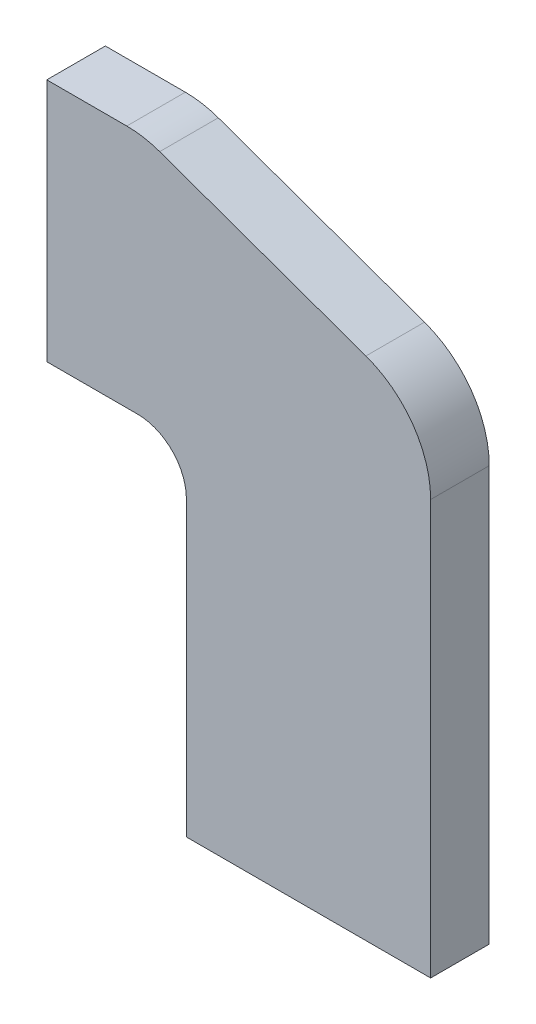
ISO-10303-21;
HEADER;
FILE_DESCRIPTION(('STEP AP214'),'2;1');
FILE_NAME('part.step','',(''),(''),'','','');
FILE_SCHEMA(('AUTOMOTIVE_DESIGN { 1 0 10303 214 1 1 1 1 }'));
ENDSEC;
DATA;
#1=APPLICATION_CONTEXT('core data for automotive mechanical design processes');
#2=APPLICATION_PROTOCOL_DEFINITION('international standard','automotive_design',2000,#1);
#3=PRODUCT_CONTEXT('',#1,'mechanical');
#4=PRODUCT('Part','Part','',(#3));
#5=PRODUCT_RELATED_PRODUCT_CATEGORY('part','',(#4));
#6=PRODUCT_DEFINITION_FORMATION('','',#4);
#7=PRODUCT_DEFINITION_CONTEXT('part definition',#1,'design');
#8=PRODUCT_DEFINITION('design','',#6,#7);
#9=PRODUCT_DEFINITION_SHAPE('','',#8);
#10=(LENGTH_UNIT() NAMED_UNIT(*) SI_UNIT(.MILLI.,.METRE.));
#11=(NAMED_UNIT(*) PLANE_ANGLE_UNIT() SI_UNIT($,.RADIAN.));
#12=(NAMED_UNIT(*) SI_UNIT($,.STERADIAN.) SOLID_ANGLE_UNIT());
#13=UNCERTAINTY_MEASURE_WITH_UNIT(LENGTH_MEASURE(1.E-05),#10,'distance_accuracy_value','');
#14=(GEOMETRIC_REPRESENTATION_CONTEXT(3) GLOBAL_UNCERTAINTY_ASSIGNED_CONTEXT((#13)) GLOBAL_UNIT_ASSIGNED_CONTEXT((#10,
#11,#12)) REPRESENTATION_CONTEXT('',''));
#15=CARTESIAN_POINT('',(0.,0.,0.));
#16=DIRECTION('',(0.,0.,1.));
#17=DIRECTION('',(1.,0.,0.));
#18=AXIS2_PLACEMENT_3D('',#15,#16,#17);
#19=CARTESIAN_POINT('',(0.,0.,12.));
#20=DIRECTION('',(1.,0.,0.));
#21=DIRECTION('',(0.,1.,0.));
#22=AXIS2_PLACEMENT_3D('',#19,#20,#21);
#23=PLANE('',#22);
#24=CARTESIAN_POINT('',(0.,7.,6.));
#25=DIRECTION('',(-1.,0.,0.));
#26=DIRECTION('',(0.,-1.,0.));
#27=AXIS2_PLACEMENT_3D('',#24,#25,#26);
#28=CIRCLE('',#27,2.5);
#29=CARTESIAN_POINT('',(0.,4.5,6.));
#30=VERTEX_POINT('',#29);
#31=EDGE_CURVE('E149',#30,#30,#28,.T.);
#32=ORIENTED_EDGE('',*,*,#31,.F.);
#33=EDGE_LOOP('',(#32));
#34=FACE_BOUND('',#33,.T.);
#35=CARTESIAN_POINT('',(0.,41.,6.));
#36=DIRECTION('',(-1.,0.,0.));
#37=DIRECTION('',(0.,-1.,0.));
#38=AXIS2_PLACEMENT_3D('',#35,#36,#37);
#39=CIRCLE('',#38,2.5);
#40=CARTESIAN_POINT('',(0.,38.5,6.));
#41=VERTEX_POINT('',#40);
#42=EDGE_CURVE('E144',#41,#41,#39,.T.);
#43=ORIENTED_EDGE('',*,*,#42,.F.);
#44=EDGE_LOOP('',(#43));
#45=FACE_BOUND('',#44,.T.);
#46=DIRECTION('',(0.,-1.,0.));
#47=VECTOR('',#46,1.);
#48=CARTESIAN_POINT('',(0.,0.,0.));
#49=LINE('',#48,#47);
#50=CARTESIAN_POINT('',(0.,50.,0.));
#51=VERTEX_POINT('',#50);
#52=CARTESIAN_POINT('',(0.,0.,0.));
#53=VERTEX_POINT('',#52);
#54=EDGE_CURVE('E159',#51,#53,#49,.T.);
#55=ORIENTED_EDGE('',*,*,#54,.T.);
#56=DIRECTION('',(0.,0.,-1.));
#57=VECTOR('',#56,1.);
#58=CARTESIAN_POINT('',(0.,0.,12.));
#59=LINE('',#58,#57);
#60=CARTESIAN_POINT('',(0.,0.,12.));
#61=VERTEX_POINT('',#60);
#62=EDGE_CURVE('E177',#61,#53,#59,.T.);
#63=ORIENTED_EDGE('',*,*,#62,.F.);
#64=DIRECTION('',(0.,-1.,0.));
#65=VECTOR('',#64,1.);
#66=CARTESIAN_POINT('',(0.,0.,12.));
#67=LINE('',#66,#65);
#68=CARTESIAN_POINT('',(0.,50.,12.));
#69=VERTEX_POINT('',#68);
#70=EDGE_CURVE('E161',#69,#61,#67,.T.);
#71=ORIENTED_EDGE('',*,*,#70,.F.);
#72=DIRECTION('',(0.,0.,-1.));
#73=VECTOR('',#72,1.);
#74=CARTESIAN_POINT('',(0.,50.,12.));
#75=LINE('',#74,#73);
#76=EDGE_CURVE('E169',#69,#51,#75,.T.);
#77=ORIENTED_EDGE('',*,*,#76,.T.);
#78=EDGE_LOOP('',(#55,#63,#71,#77));
#79=FACE_BOUND('',#78,.T.);
#80=ADVANCED_FACE('F34',(#34,#45,#79),#23,.F.);
#81=CARTESIAN_POINT('',(0.,0.,12.));
#82=DIRECTION('',(0.,1.,0.));
#83=DIRECTION('',(0.,0.,1.));
#84=AXIS2_PLACEMENT_3D('',#81,#82,#83);
#85=PLANE('',#84);
#86=DIRECTION('',(1.,0.,0.));
#87=VECTOR('',#86,1.);
#88=CARTESIAN_POINT('',(0.,0.,0.));
#89=LINE('',#88,#87);
#90=CARTESIAN_POINT('',(18.59583866,0.,0.));
#91=VERTEX_POINT('',#90);
#92=EDGE_CURVE('E121',#53,#91,#89,.T.);
#93=ORIENTED_EDGE('',*,*,#92,.T.);
#94=DIRECTION('',(0.,0.,1.));
#95=VECTOR('',#94,1.);
#96=CARTESIAN_POINT('',(18.59583866,0.,12.));
#97=LINE('',#96,#95);
#98=CARTESIAN_POINT('',(18.59583866,0.,12.));
#99=VERTEX_POINT('',#98);
#100=EDGE_CURVE('E198',#91,#99,#97,.T.);
#101=ORIENTED_EDGE('',*,*,#100,.T.);
#102=DIRECTION('',(1.,0.,0.));
#103=VECTOR('',#102,1.);
#104=CARTESIAN_POINT('',(0.,0.,12.));
#105=LINE('',#104,#103);
#106=EDGE_CURVE('E164',#61,#99,#105,.T.);
#107=ORIENTED_EDGE('',*,*,#106,.F.);
#108=ORIENTED_EDGE('',*,*,#62,.T.);
#109=EDGE_LOOP('',(#93,#101,#107,#108));
#110=FACE_BOUND('',#109,.T.);
#111=ADVANCED_FACE('F203',(#110),#85,.F.);
#112=CARTESIAN_POINT('',(78.62,0.,12.));
#113=DIRECTION('',(-1.,0.,0.));
#114=DIRECTION('',(0.,-1.,0.));
#115=AXIS2_PLACEMENT_3D('',#112,#113,#114);
#116=PLANE('',#115);
#117=DIRECTION('',(0.,1.,0.));
#118=VECTOR('',#117,1.);
#119=CARTESIAN_POINT('',(78.62,0.,0.));
#120=LINE('',#119,#118);
#121=CARTESIAN_POINT('',(78.62,-70.,0.));
#122=VERTEX_POINT('',#121);
#123=CARTESIAN_POINT('',(78.62,14.8716390702295,0.));
#124=VERTEX_POINT('',#123);
#125=EDGE_CURVE('E109',#122,#124,#120,.T.);
#126=ORIENTED_EDGE('',*,*,#125,.T.);
#127=DIRECTION('',(0.,0.,1.));
#128=VECTOR('',#127,1.);
#129=CARTESIAN_POINT('',(78.62,14.8716390702295,12.));
#130=LINE('',#129,#128);
#131=CARTESIAN_POINT('',(78.62,14.8716390702295,12.));
#132=VERTEX_POINT('',#131);
#133=EDGE_CURVE('E180',#124,#132,#130,.T.);
#134=ORIENTED_EDGE('',*,*,#133,.T.);
#135=DIRECTION('',(0.,1.,0.));
#136=VECTOR('',#135,1.);
#137=CARTESIAN_POINT('',(78.62,0.,12.));
#138=LINE('',#137,#136);
#139=CARTESIAN_POINT('',(78.62,-70.,12.));
#140=VERTEX_POINT('',#139);
#141=EDGE_CURVE('E127',#140,#132,#138,.T.);
#142=ORIENTED_EDGE('',*,*,#141,.F.);
#143=DIRECTION('',(0.,0.,1.));
#144=VECTOR('',#143,1.);
#145=CARTESIAN_POINT('',(78.62,-70.,-94.3526190297352));
#146=LINE('',#145,#144);
#147=EDGE_CURVE('E124',#122,#140,#146,.T.);
#148=ORIENTED_EDGE('',*,*,#147,.F.);
#149=EDGE_LOOP('',(#126,#134,#142,#148));
#150=FACE_BOUND('',#149,.T.);
#151=ADVANCED_FACE('F125',(#150),#116,.F.);
#152=CARTESIAN_POINT('',(0.,50.,12.));
#153=DIRECTION('',(0.,-1.,0.));
#154=DIRECTION('',(0.,0.,-1.));
#155=AXIS2_PLACEMENT_3D('',#152,#153,#154);
#156=PLANE('',#155);
#157=DIRECTION('',(-1.,0.,0.));
#158=VECTOR('',#157,1.);
#159=CARTESIAN_POINT('',(0.,50.,12.));
#160=LINE('',#159,#158);
#161=CARTESIAN_POINT('',(16.3850409596238,50.,12.));
#162=VERTEX_POINT('',#161);
#163=EDGE_CURVE('E167',#162,#69,#160,.T.);
#164=ORIENTED_EDGE('',*,*,#163,.F.);
#165=DIRECTION('',(0.,0.,1.));
#166=VECTOR('',#165,1.);
#167=CARTESIAN_POINT('',(16.3850409596238,50.,12.));
#168=LINE('',#167,#166);
#169=CARTESIAN_POINT('',(16.3850409596238,50.,0.));
#170=VERTEX_POINT('',#169);
#171=EDGE_CURVE('E194',#162,#170,#168,.F.);
#172=ORIENTED_EDGE('',*,*,#171,.T.);
#173=DIRECTION('',(-1.,0.,0.));
#174=VECTOR('',#173,1.);
#175=CARTESIAN_POINT('',(0.,50.,0.));
#176=LINE('',#175,#174);
#177=EDGE_CURVE('E120',#170,#51,#176,.T.);
#178=ORIENTED_EDGE('',*,*,#177,.T.);
#179=ORIENTED_EDGE('',*,*,#76,.F.);
#180=EDGE_LOOP('',(#164,#172,#178,#179));
#181=FACE_BOUND('',#180,.T.);
#182=ADVANCED_FACE('F280',(#181),#156,.F.);
#183=CARTESIAN_POINT('',(0.,0.,12.));
#184=DIRECTION('',(0.,0.,-1.));
#185=DIRECTION('',(-1.,0.,0.));
#186=AXIS2_PLACEMENT_3D('',#183,#184,#185);
#187=PLANE('',#186);
#188=ORIENTED_EDGE('',*,*,#106,.T.);
#189=CARTESIAN_POINT('',(18.59583866,-10.,12.));
#190=DIRECTION('',(0.,0.,-1.));
#191=DIRECTION('',(-1.,0.,0.));
#192=AXIS2_PLACEMENT_3D('',#189,#190,#191);
#193=CIRCLE('',#192,10.);
#194=CARTESIAN_POINT('',(28.59583866,-10.,12.));
#195=VERTEX_POINT('',#194);
#196=EDGE_CURVE('E42',#99,#195,#193,.T.);
#197=ORIENTED_EDGE('',*,*,#196,.T.);
#198=DIRECTION('',(0.,-1.,0.));
#199=VECTOR('',#198,1.);
#200=CARTESIAN_POINT('',(28.59583866,9.99999999999999,12.));
#201=LINE('',#200,#199);
#202=CARTESIAN_POINT('',(28.59583866,-70.,12.));
#203=VERTEX_POINT('',#202);
#204=EDGE_CURVE('E138',#195,#203,#201,.T.);
#205=ORIENTED_EDGE('',*,*,#204,.T.);
#206=DIRECTION('',(1.,0.,0.));
#207=VECTOR('',#206,1.);
#208=CARTESIAN_POINT('',(28.59583866,-70.,12.));
#209=LINE('',#208,#207);
#210=EDGE_CURVE('E136',#203,#140,#209,.T.);
#211=ORIENTED_EDGE('',*,*,#210,.T.);
#212=ORIENTED_EDGE('',*,*,#141,.T.);
#213=CARTESIAN_POINT('',(58.62,14.8716390702295,12.));
#214=DIRECTION('',(0.,0.,-1.));
#215=DIRECTION('',(-1.,0.,0.));
#216=AXIS2_PLACEMENT_3D('',#213,#214,#215);
#217=CIRCLE('',#216,20.);
#218=CARTESIAN_POINT('',(65.3642982184908,33.7001929589397,12.));
#219=VERTEX_POINT('',#218);
#220=EDGE_CURVE('E182',#132,#219,#217,.F.);
#221=ORIENTED_EDGE('',*,*,#220,.T.);
#222=DIRECTION('',(0.941427694435507,-0.337214910924539,0.));
#223=VECTOR('',#222,1.);
#224=CARTESIAN_POINT('',(19.8589268209521,50.,12.));
#225=LINE('',#224,#223);
#226=CARTESIAN_POINT('',(23.1293391781145,48.8285538887102,12.));
#227=VERTEX_POINT('',#226);
#228=EDGE_CURVE('E148',#227,#219,#225,.T.);
#229=ORIENTED_EDGE('',*,*,#228,.F.);
#230=CARTESIAN_POINT('',(16.3850409596238,30.,12.));
#231=DIRECTION('',(0.,0.,-1.));
#232=DIRECTION('',(-1.,0.,0.));
#233=AXIS2_PLACEMENT_3D('',#230,#231,#232);
#234=CIRCLE('',#233,20.);
#235=EDGE_CURVE('E192',#227,#162,#234,.F.);
#236=ORIENTED_EDGE('',*,*,#235,.T.);
#237=ORIENTED_EDGE('',*,*,#163,.T.);
#238=ORIENTED_EDGE('',*,*,#70,.T.);
#239=EDGE_LOOP('',(#188,#197,#205,#211,#212,#221,#229,#236,#237,#238));
#240=FACE_BOUND('',#239,.T.);
#241=ADVANCED_FACE('F206',(#240),#187,.F.);
#242=CARTESIAN_POINT('',(0.,0.,0.));
#243=DIRECTION('',(0.,0.,-1.));
#244=DIRECTION('',(-1.,0.,0.));
#245=AXIS2_PLACEMENT_3D('',#242,#243,#244);
#246=PLANE('',#245);
#247=DIRECTION('',(0.,-1.,0.));
#248=VECTOR('',#247,1.);
#249=CARTESIAN_POINT('',(28.59583866,9.99999999999999,0.));
#250=LINE('',#249,#248);
#251=CARTESIAN_POINT('',(28.59583866,-10.,0.));
#252=VERTEX_POINT('',#251);
#253=CARTESIAN_POINT('',(28.59583866,-70.,0.));
#254=VERTEX_POINT('',#253);
#255=EDGE_CURVE('E131',#252,#254,#250,.T.);
#256=ORIENTED_EDGE('',*,*,#255,.F.);
#257=CARTESIAN_POINT('',(18.59583866,-10.,0.));
#258=DIRECTION('',(0.,0.,-1.));
#259=DIRECTION('',(-1.,0.,0.));
#260=AXIS2_PLACEMENT_3D('',#257,#258,#259);
#261=CIRCLE('',#260,10.);
#262=EDGE_CURVE('E11',#252,#91,#261,.F.);
#263=ORIENTED_EDGE('',*,*,#262,.T.);
#264=ORIENTED_EDGE('',*,*,#92,.F.);
#265=ORIENTED_EDGE('',*,*,#54,.F.);
#266=ORIENTED_EDGE('',*,*,#177,.F.);
#267=CARTESIAN_POINT('',(16.3850409596238,30.,0.));
#268=DIRECTION('',(0.,0.,-1.));
#269=DIRECTION('',(-1.,0.,0.));
#270=AXIS2_PLACEMENT_3D('',#267,#268,#269);
#271=CIRCLE('',#270,20.);
#272=CARTESIAN_POINT('',(23.1293391781145,48.8285538887102,0.));
#273=VERTEX_POINT('',#272);
#274=EDGE_CURVE('E196',#170,#273,#271,.T.);
#275=ORIENTED_EDGE('',*,*,#274,.T.);
#276=DIRECTION('',(0.941427694435507,-0.337214910924539,0.));
#277=VECTOR('',#276,1.);
#278=CARTESIAN_POINT('',(19.8589268209521,50.,0.));
#279=LINE('',#278,#277);
#280=CARTESIAN_POINT('',(65.3642982184908,33.7001929589397,0.));
#281=VERTEX_POINT('',#280);
#282=EDGE_CURVE('E157',#273,#281,#279,.T.);
#283=ORIENTED_EDGE('',*,*,#282,.T.);
#284=CARTESIAN_POINT('',(58.62,14.8716390702295,0.));
#285=DIRECTION('',(0.,0.,-1.));
#286=DIRECTION('',(-1.,0.,0.));
#287=AXIS2_PLACEMENT_3D('',#284,#285,#286);
#288=CIRCLE('',#287,20.);
#289=EDGE_CURVE('E116',#281,#124,#288,.T.);
#290=ORIENTED_EDGE('',*,*,#289,.T.);
#291=ORIENTED_EDGE('',*,*,#125,.F.);
#292=DIRECTION('',(1.,0.,0.));
#293=VECTOR('',#292,1.);
#294=CARTESIAN_POINT('',(28.59583866,-70.,0.));
#295=LINE('',#294,#293);
#296=EDGE_CURVE('E113',#254,#122,#295,.T.);
#297=ORIENTED_EDGE('',*,*,#296,.F.);
#298=EDGE_LOOP('',(#256,#263,#264,#265,#266,#275,#283,#290,#291,#297));
#299=FACE_BOUND('',#298,.T.);
#300=ADVANCED_FACE('F111',(#299),#246,.T.);
#301=CARTESIAN_POINT('',(19.8589268209521,50.,0.));
#302=DIRECTION('',(-0.337214910924539,-0.941427694435508,0.));
#303=DIRECTION('',(0.941427694435508,-0.337214910924539,0.));
#304=AXIS2_PLACEMENT_3D('',#301,#302,#303);
#305=PLANE('',#304);
#306=ORIENTED_EDGE('',*,*,#282,.F.);
#307=DIRECTION('',(0.,0.,1.));
#308=VECTOR('',#307,1.);
#309=CARTESIAN_POINT('',(23.1293391781145,48.8285538887102,0.));
#310=LINE('',#309,#308);
#311=EDGE_CURVE('E189',#273,#227,#310,.T.);
#312=ORIENTED_EDGE('',*,*,#311,.T.);
#313=ORIENTED_EDGE('',*,*,#228,.T.);
#314=DIRECTION('',(0.,0.,1.));
#315=VECTOR('',#314,1.);
#316=CARTESIAN_POINT('',(65.3642982184908,33.7001929589397,0.));
#317=LINE('',#316,#315);
#318=EDGE_CURVE('E185',#219,#281,#317,.F.);
#319=ORIENTED_EDGE('',*,*,#318,.T.);
#320=EDGE_LOOP('',(#306,#312,#313,#319));
#321=FACE_BOUND('',#320,.T.);
#322=ADVANCED_FACE('F241',(#321),#305,.F.);
#323=CARTESIAN_POINT('',(58.62,14.8716390702295,12.));
#324=DIRECTION('',(0.,0.,1.));
#325=DIRECTION('',(1.,0.,0.));
#326=AXIS2_PLACEMENT_3D('',#323,#324,#325);
#327=CYLINDRICAL_SURFACE('',#326,20.);
#328=ORIENTED_EDGE('',*,*,#289,.F.);
#329=ORIENTED_EDGE('',*,*,#318,.F.);
#330=ORIENTED_EDGE('',*,*,#220,.F.);
#331=ORIENTED_EDGE('',*,*,#133,.F.);
#332=EDGE_LOOP('',(#328,#329,#330,#331));
#333=FACE_BOUND('',#332,.T.);
#334=ADVANCED_FACE('F238',(#333),#327,.T.);
#335=CARTESIAN_POINT('',(16.3850409596238,30.,0.));
#336=DIRECTION('',(0.,0.,1.));
#337=DIRECTION('',(1.,0.,0.));
#338=AXIS2_PLACEMENT_3D('',#335,#336,#337);
#339=CYLINDRICAL_SURFACE('',#338,20.);
#340=ORIENTED_EDGE('',*,*,#274,.F.);
#341=ORIENTED_EDGE('',*,*,#171,.F.);
#342=ORIENTED_EDGE('',*,*,#235,.F.);
#343=ORIENTED_EDGE('',*,*,#311,.F.);
#344=EDGE_LOOP('',(#340,#341,#342,#343));
#345=FACE_BOUND('',#344,.T.);
#346=ADVANCED_FACE('F240',(#345),#339,.T.);
#347=CARTESIAN_POINT('',(20.,41.,6.));
#348=DIRECTION('',(-1.,0.,0.));
#349=DIRECTION('',(0.,-1.,0.));
#350=AXIS2_PLACEMENT_3D('',#347,#348,#349);
#351=CYLINDRICAL_SURFACE('',#350,2.5);
#352=CARTESIAN_POINT('',(20.,41.,6.));
#353=DIRECTION('',(-1.,0.,0.));
#354=DIRECTION('',(0.,-1.,0.));
#355=AXIS2_PLACEMENT_3D('',#352,#353,#354);
#356=CIRCLE('',#355,2.5);
#357=CARTESIAN_POINT('',(20.,38.5,6.));
#358=VERTEX_POINT('',#357);
#359=EDGE_CURVE('E152',#358,#358,#356,.T.);
#360=ORIENTED_EDGE('',*,*,#359,.F.);
#361=EDGE_LOOP('',(#360));
#362=FACE_BOUND('',#361,.T.);
#363=ORIENTED_EDGE('',*,*,#42,.T.);
#364=EDGE_LOOP('',(#363));
#365=FACE_BOUND('',#364,.T.);
#366=ADVANCED_FACE('F244',(#362,#365),#351,.F.);
#367=CARTESIAN_POINT('',(20.,41.,6.));
#368=DIRECTION('',(-1.,0.,0.));
#369=DIRECTION('',(0.,-1.,0.));
#370=AXIS2_PLACEMENT_3D('',#367,#368,#369);
#371=PLANE('',#370);
#372=ORIENTED_EDGE('',*,*,#359,.T.);
#373=EDGE_LOOP('',(#372));
#374=FACE_BOUND('',#373,.T.);
#375=ADVANCED_FACE('F249',(#374),#371,.T.);
#376=CARTESIAN_POINT('',(20.,7.00000000000001,6.));
#377=DIRECTION('',(-1.,0.,0.));
#378=DIRECTION('',(0.,-1.,0.));
#379=AXIS2_PLACEMENT_3D('',#376,#377,#378);
#380=CYLINDRICAL_SURFACE('',#379,2.5);
#381=CARTESIAN_POINT('',(20.,7.00000000000001,6.));
#382=DIRECTION('',(-1.,0.,0.));
#383=DIRECTION('',(0.,-1.,0.));
#384=AXIS2_PLACEMENT_3D('',#381,#382,#383);
#385=CIRCLE('',#384,2.5);
#386=CARTESIAN_POINT('',(20.,4.50000000000001,6.));
#387=VERTEX_POINT('',#386);
#388=EDGE_CURVE('E145',#387,#387,#385,.T.);
#389=ORIENTED_EDGE('',*,*,#388,.F.);
#390=EDGE_LOOP('',(#389));
#391=FACE_BOUND('',#390,.T.);
#392=ORIENTED_EDGE('',*,*,#31,.T.);
#393=EDGE_LOOP('',(#392));
#394=FACE_BOUND('',#393,.T.);
#395=ADVANCED_FACE('F265',(#391,#394),#380,.F.);
#396=CARTESIAN_POINT('',(20.,7.00000000000001,6.));
#397=DIRECTION('',(-1.,0.,0.));
#398=DIRECTION('',(0.,-1.,0.));
#399=AXIS2_PLACEMENT_3D('',#396,#397,#398);
#400=PLANE('',#399);
#401=ORIENTED_EDGE('',*,*,#388,.T.);
#402=EDGE_LOOP('',(#401));
#403=FACE_BOUND('',#402,.T.);
#404=ADVANCED_FACE('F260',(#403),#400,.T.);
#405=CARTESIAN_POINT('',(28.59583866,9.99999999999999,-94.3526190297352));
#406=DIRECTION('',(-1.,0.,0.));
#407=DIRECTION('',(0.,-1.,0.));
#408=AXIS2_PLACEMENT_3D('',#405,#406,#407);
#409=PLANE('',#408);
#410=ORIENTED_EDGE('',*,*,#204,.F.);
#411=DIRECTION('',(0.,0.,1.));
#412=VECTOR('',#411,1.);
#413=CARTESIAN_POINT('',(28.59583866,-10.,-94.3526190297352));
#414=LINE('',#413,#412);
#415=EDGE_CURVE('E55',#195,#252,#414,.F.);
#416=ORIENTED_EDGE('',*,*,#415,.T.);
#417=ORIENTED_EDGE('',*,*,#255,.T.);
#418=DIRECTION('',(0.,0.,1.));
#419=VECTOR('',#418,1.);
#420=CARTESIAN_POINT('',(28.59583866,-70.,-94.3526190297352));
#421=LINE('',#420,#419);
#422=EDGE_CURVE('E135',#254,#203,#421,.T.);
#423=ORIENTED_EDGE('',*,*,#422,.T.);
#424=EDGE_LOOP('',(#410,#416,#417,#423));
#425=FACE_BOUND('',#424,.T.);
#426=ADVANCED_FACE('F224',(#425),#409,.T.);
#427=CARTESIAN_POINT('',(28.59583866,-70.,-94.3526190297352));
#428=DIRECTION('',(0.,-1.,0.));
#429=DIRECTION('',(0.,0.,-1.));
#430=AXIS2_PLACEMENT_3D('',#427,#428,#429);
#431=PLANE('',#430);
#432=CARTESIAN_POINT('',(38.59583866,-70.,6.));
#433=DIRECTION('',(0.,-1.,0.));
#434=DIRECTION('',(0.,0.,-1.));
#435=AXIS2_PLACEMENT_3D('',#432,#433,#434);
#436=CIRCLE('',#435,2.5);
#437=CARTESIAN_POINT('',(38.59583866,-70.,3.5));
#438=VERTEX_POINT('',#437);
#439=EDGE_CURVE('E405',#438,#438,#436,.T.);
#440=ORIENTED_EDGE('',*,*,#439,.F.);
#441=EDGE_LOOP('',(#440));
#442=FACE_BOUND('',#441,.T.);
#443=CARTESIAN_POINT('',(68.59583866,-70.,6.));
#444=DIRECTION('',(0.,-1.,0.));
#445=DIRECTION('',(0.,0.,-1.));
#446=AXIS2_PLACEMENT_3D('',#443,#444,#445);
#447=CIRCLE('',#446,2.50000000000001);
#448=CARTESIAN_POINT('',(68.59583866,-70.,3.49999999999999));
#449=VERTEX_POINT('',#448);
#450=EDGE_CURVE('E413',#449,#449,#447,.T.);
#451=ORIENTED_EDGE('',*,*,#450,.F.);
#452=EDGE_LOOP('',(#451));
#453=FACE_BOUND('',#452,.T.);
#454=ORIENTED_EDGE('',*,*,#422,.F.);
#455=ORIENTED_EDGE('',*,*,#296,.T.);
#456=ORIENTED_EDGE('',*,*,#147,.T.);
#457=ORIENTED_EDGE('',*,*,#210,.F.);
#458=EDGE_LOOP('',(#454,#455,#456,#457));
#459=FACE_BOUND('',#458,.T.);
#460=ADVANCED_FACE('F133',(#442,#453,#459),#431,.T.);
#461=CARTESIAN_POINT('',(18.59583866,-10.,12.));
#462=DIRECTION('',(0.,0.,1.));
#463=DIRECTION('',(1.,0.,0.));
#464=AXIS2_PLACEMENT_3D('',#461,#462,#463);
#465=CYLINDRICAL_SURFACE('',#464,10.);
#466=ORIENTED_EDGE('',*,*,#262,.F.);
#467=ORIENTED_EDGE('',*,*,#415,.F.);
#468=ORIENTED_EDGE('',*,*,#196,.F.);
#469=ORIENTED_EDGE('',*,*,#100,.F.);
#470=EDGE_LOOP('',(#466,#467,#468,#469));
#471=FACE_BOUND('',#470,.T.);
#472=ADVANCED_FACE('F36',(#471),#465,.F.);
#473=CARTESIAN_POINT('',(68.59583866,-40.,6.));
#474=DIRECTION('',(0.,-1.,0.));
#475=DIRECTION('',(0.,0.,-1.));
#476=AXIS2_PLACEMENT_3D('',#473,#474,#475);
#477=CYLINDRICAL_SURFACE('',#476,2.50000000000001);
#478=CARTESIAN_POINT('',(68.59583866,-40.,6.));
#479=DIRECTION('',(0.,-1.,0.));
#480=DIRECTION('',(0.,0.,-1.));
#481=AXIS2_PLACEMENT_3D('',#478,#479,#480);
#482=CIRCLE('',#481,2.50000000000001);
#483=CARTESIAN_POINT('',(68.59583866,-40.,3.49999999999999));
#484=VERTEX_POINT('',#483);
#485=EDGE_CURVE('E408',#484,#484,#482,.T.);
#486=ORIENTED_EDGE('',*,*,#485,.F.);
#487=EDGE_LOOP('',(#486));
#488=FACE_BOUND('',#487,.T.);
#489=ORIENTED_EDGE('',*,*,#450,.T.);
#490=EDGE_LOOP('',(#489));
#491=FACE_BOUND('',#490,.T.);
#492=ADVANCED_FACE('F216',(#488,#491),#477,.F.);
#493=CARTESIAN_POINT('',(68.59583866,-40.,6.));
#494=DIRECTION('',(0.,-1.,0.));
#495=DIRECTION('',(0.,0.,-1.));
#496=AXIS2_PLACEMENT_3D('',#493,#494,#495);
#497=PLANE('',#496);
#498=ORIENTED_EDGE('',*,*,#485,.T.);
#499=EDGE_LOOP('',(#498));
#500=FACE_BOUND('',#499,.T.);
#501=ADVANCED_FACE('F221',(#500),#497,.T.);
#502=CARTESIAN_POINT('',(38.59583866,-40.,6.));
#503=DIRECTION('',(0.,-1.,0.));
#504=DIRECTION('',(0.,0.,-1.));
#505=AXIS2_PLACEMENT_3D('',#502,#503,#504);
#506=CYLINDRICAL_SURFACE('',#505,2.5);
#507=CARTESIAN_POINT('',(38.59583866,-40.,6.));
#508=DIRECTION('',(0.,-1.,0.));
#509=DIRECTION('',(0.,0.,-1.));
#510=AXIS2_PLACEMENT_3D('',#507,#508,#509);
#511=CIRCLE('',#510,2.5);
#512=CARTESIAN_POINT('',(38.59583866,-40.,3.5));
#513=VERTEX_POINT('',#512);
#514=EDGE_CURVE('E258',#513,#513,#511,.T.);
#515=ORIENTED_EDGE('',*,*,#514,.F.);
#516=EDGE_LOOP('',(#515));
#517=FACE_BOUND('',#516,.T.);
#518=ORIENTED_EDGE('',*,*,#439,.T.);
#519=EDGE_LOOP('',(#518));
#520=FACE_BOUND('',#519,.T.);
#521=ADVANCED_FACE('F380',(#517,#520),#506,.F.);
#522=CARTESIAN_POINT('',(38.59583866,-40.,6.));
#523=DIRECTION('',(0.,-1.,0.));
#524=DIRECTION('',(0.,0.,-1.));
#525=AXIS2_PLACEMENT_3D('',#522,#523,#524);
#526=PLANE('',#525);
#527=ORIENTED_EDGE('',*,*,#514,.T.);
#528=EDGE_LOOP('',(#527));
#529=FACE_BOUND('',#528,.T.);
#530=ADVANCED_FACE('F388',(#529),#526,.T.);
#531=CLOSED_SHELL('',(#80,#111,#151,#182,#241,#300,#322,#334,#346,#366,#375,#395,#404,#426,#460,
#472,#492,#501,#521,#530));
#532=MANIFOLD_SOLID_BREP('B2',#531);
#533=ADVANCED_BREP_SHAPE_REPRESENTATION('',(#18,#532),#14);
#534=SHAPE_DEFINITION_REPRESENTATION(#9,#533);
ENDSEC;
END-ISO-10303-21;
